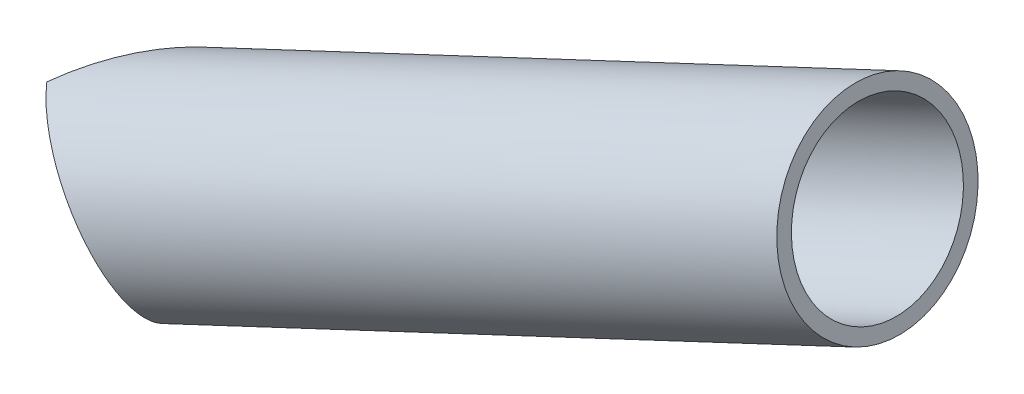
ISO-10303-21;
HEADER;
FILE_DESCRIPTION(('STEP AP214'),'2;1');
FILE_NAME('part.step','',(''),(''),'','','');
FILE_SCHEMA(('AUTOMOTIVE_DESIGN { 1 0 10303 214 1 1 1 1 }'));
ENDSEC;
DATA;
#1=APPLICATION_CONTEXT('core data for automotive mechanical design processes');
#2=APPLICATION_PROTOCOL_DEFINITION('international standard','automotive_design',2000,#1);
#3=PRODUCT_CONTEXT('',#1,'mechanical');
#4=PRODUCT('Part','Part','',(#3));
#5=PRODUCT_RELATED_PRODUCT_CATEGORY('part','',(#4));
#6=PRODUCT_DEFINITION_FORMATION('','',#4);
#7=PRODUCT_DEFINITION_CONTEXT('part definition',#1,'design');
#8=PRODUCT_DEFINITION('design','',#6,#7);
#9=PRODUCT_DEFINITION_SHAPE('','',#8);
#10=(LENGTH_UNIT() NAMED_UNIT(*) SI_UNIT(.MILLI.,.METRE.));
#11=(NAMED_UNIT(*) PLANE_ANGLE_UNIT() SI_UNIT($,.RADIAN.));
#12=(NAMED_UNIT(*) SI_UNIT($,.STERADIAN.) SOLID_ANGLE_UNIT());
#13=UNCERTAINTY_MEASURE_WITH_UNIT(LENGTH_MEASURE(1.E-05),#10,'distance_accuracy_value','');
#14=(GEOMETRIC_REPRESENTATION_CONTEXT(3) GLOBAL_UNCERTAINTY_ASSIGNED_CONTEXT((#13)) GLOBAL_UNIT_ASSIGNED_CONTEXT((#10,
#11,#12)) REPRESENTATION_CONTEXT('',''));
#15=CARTESIAN_POINT('',(0.,0.,0.));
#16=DIRECTION('',(0.,0.,1.));
#17=DIRECTION('',(1.,0.,0.));
#18=AXIS2_PLACEMENT_3D('',#15,#16,#17);
#19=CARTESIAN_POINT('',(-150.,499.999999999999,-1140.));
#20=DIRECTION('',(0.904818702200994,0.425797036329879,0.));
#21=DIRECTION('',(-0.425797036329879,0.904818702200994,0.));
#22=AXIS2_PLACEMENT_3D('',#19,#20,#21);
#23=CYLINDRICAL_SURFACE('',#22,9.39999999999998);
#24=CARTESIAN_POINT('',(-64.9999999999999,539.999999999999,-1140.));
#25=DIRECTION('',(0.975914622854119,0.218152810890676,0.));
#26=DIRECTION('',(-0.218152810890676,0.975914622854119,0.));
#27=AXIS2_PLACEMENT_3D('',#24,#25,#26);
#28=ELLIPSE('',#27,9.63199011457491,9.39999999999998);
#29=CARTESIAN_POINT('',(-67.1012457179656,549.399999999999,-1140.));
#30=VERTEX_POINT('',#29);
#31=EDGE_CURVE('E87',#30,#30,#28,.T.);
#32=ORIENTED_EDGE('',*,*,#31,.T.);
#33=EDGE_LOOP('',(#32));
#34=FACE_BOUND('',#33,.T.);
#35=CARTESIAN_POINT('',(-147.174804903302,511.718325089253,-1140.));
#36=CARTESIAN_POINT('',(-147.069765153826,511.767756026014,-1140.16182487305));
#37=CARTESIAN_POINT('',(-146.960994957135,511.814331371933,-1140.3220936696));
#38=CARTESIAN_POINT('',(-146.737299798762,511.901598910841,-1140.63992880745));
#39=CARTESIAN_POINT('',(-146.622373747903,511.942290057974,-1140.79749466396));
#40=CARTESIAN_POINT('',(-146.269828266371,512.055292250158,-1141.26688039598));
#41=CARTESIAN_POINT('',(-146.02455741703,512.118478234342,-1141.57521443499));
#42=CARTESIAN_POINT('',(-145.519557761149,512.218586126981,-1142.18489613633));
#43=CARTESIAN_POINT('',(-145.259807483312,512.25546784866,-1142.48623243121));
#44=CARTESIAN_POINT('',(-144.730620795151,512.30019420227,-1143.08229972841));
#45=CARTESIAN_POINT('',(-144.46118989732,512.308055103166,-1143.37703433946));
#46=CARTESIAN_POINT('',(-143.981000072123,512.293415296658,-1143.89063503474));
#47=CARTESIAN_POINT('',(-143.771509830137,512.27768425329,-1144.11088975301));
#48=CARTESIAN_POINT('',(-143.350546472571,512.225643876017,-1144.54713309729));
#49=CARTESIAN_POINT('',(-143.139073201271,512.189332912515,-1144.76312138405));
#50=CARTESIAN_POINT('',(-142.71640329377,512.094196267052,-1145.18944634617));
#51=CARTESIAN_POINT('',(-142.505207172687,512.035423611243,-1145.39979509284));
#52=CARTESIAN_POINT('',(-142.084811079382,511.893204163989,-1145.81384037692));
#53=CARTESIAN_POINT('',(-141.875610365919,511.809766935125,-1146.01753945851));
#54=CARTESIAN_POINT('',(-141.374090394241,511.574790607243,-1146.50077049964));
#55=CARTESIAN_POINT('',(-141.08387155746,511.409369453457,-1146.77610947676));
#56=CARTESIAN_POINT('',(-140.662688460546,511.115972602987,-1147.16985585743));
#57=CARTESIAN_POINT('',(-140.524665225587,511.01064275878,-1147.29788200343));
#58=CARTESIAN_POINT('',(-140.254657767163,510.784346458716,-1147.54635337189));
#59=CARTESIAN_POINT('',(-140.12267255663,510.663382571098,-1147.66679983467));
#60=CARTESIAN_POINT('',(-139.886826828217,510.426242301565,-1147.88015846631));
#61=CARTESIAN_POINT('',(-139.781837679675,510.312378505739,-1147.97439853996));
#62=CARTESIAN_POINT('',(-139.578284500829,510.073664780666,-1148.15560613186));
#63=CARTESIAN_POINT('',(-139.479719209967,509.948817018179,-1148.24257507789));
#64=CARTESIAN_POINT('',(-139.290036784035,509.688592624331,-1148.40833869316));
#65=CARTESIAN_POINT('',(-139.198915975857,509.553221250456,-1148.48713739884));
#66=CARTESIAN_POINT('',(-139.024985107044,509.272583927366,-1148.63581087531));
#67=CARTESIAN_POINT('',(-138.942175128538,509.127317880394,-1148.70568555792));
#68=CARTESIAN_POINT('',(-138.785459721982,508.827491450442,-1148.83600065377));
#69=CARTESIAN_POINT('',(-138.71157652054,508.672909248155,-1148.89641762458));
#70=CARTESIAN_POINT('',(-138.573541669559,508.355972796253,-1149.00712696957));
#71=CARTESIAN_POINT('',(-138.509390041301,508.193618529643,-1149.05741932162));
#72=CARTESIAN_POINT('',(-138.391154679292,507.862440086314,-1149.1476293901));
#73=CARTESIAN_POINT('',(-138.337073977837,507.693613979354,-1149.18754398329));
#74=CARTESIAN_POINT('',(-138.239108831187,507.350947637192,-1149.25694220311));
#75=CARTESIAN_POINT('',(-138.195224493118,507.177107349332,-1149.28642572016));
#76=CARTESIAN_POINT('',(-138.11864051748,506.830828995647,-1149.33443068406));
#77=CARTESIAN_POINT('',(-138.085656401997,506.658493504948,-1149.35324205497));
#78=CARTESIAN_POINT('',(-138.028888344476,506.311530662622,-1149.38149201013));
#79=CARTESIAN_POINT('',(-138.005107260492,506.136902616408,-1149.39092768412));
#80=CARTESIAN_POINT('',(-137.946982350876,505.611304831234,-1149.40575419112));
#81=CARTESIAN_POINT('',(-137.925817163662,505.258435965289,-1149.39768910654));
#82=CARTESIAN_POINT('',(-137.911366579613,504.361145344361,-1149.33625911727));
#83=CARTESIAN_POINT('',(-137.93976262982,503.817901650105,-1149.26045812125));
#84=CARTESIAN_POINT('',(-138.025286854095,503.017661568634,-1149.09981690799));
#85=CARTESIAN_POINT('',(-138.061057339753,502.752870836155,-1149.03828719193));
#86=CARTESIAN_POINT('',(-138.145042440875,502.228983971204,-1148.90088877483));
#87=CARTESIAN_POINT('',(-138.19325661318,501.969887636292,-1148.82502058445));
#88=CARTESIAN_POINT('',(-138.325000526231,501.340210345956,-1148.6221259745));
#89=CARTESIAN_POINT('',(-138.414564241438,500.973298092604,-1148.48763915072));
#90=CARTESIAN_POINT('',(-138.611277718176,500.254623788744,-1148.19315439539));
#91=CARTESIAN_POINT('',(-138.718437939975,499.902870907719,-1148.03314129133));
#92=CARTESIAN_POINT('',(-138.945544417175,499.215621437435,-1147.68884042698));
#93=CARTESIAN_POINT('',(-139.065495846927,498.880131507364,-1147.50454283586));
#94=CARTESIAN_POINT('',(-139.313152688936,498.226868575358,-1147.11168986045));
#95=CARTESIAN_POINT('',(-139.440854111933,497.909086617265,-1146.90314690652));
#96=CARTESIAN_POINT('',(-139.648518871169,497.411976698254,-1146.54553161621));
#97=CARTESIAN_POINT('',(-139.727890226601,497.226536671546,-1146.40455947558));
#98=CARTESIAN_POINT('',(-139.885654472558,496.863798962395,-1146.11201178023));
#99=CARTESIAN_POINT('',(-139.964047567875,496.686499554228,-1145.9604384902));
#100=CARTESIAN_POINT('',(-140.11768140451,496.341367445269,-1145.64585474945));
#101=CARTESIAN_POINT('',(-140.192926414663,496.173521810484,-1145.48286064501));
#102=CARTESIAN_POINT('',(-140.337731655912,495.848734934272,-1145.14397088378));
#103=CARTESIAN_POINT('',(-140.407294086787,495.691789476846,-1144.96808026986));
#104=CARTESIAN_POINT('',(-140.516250243288,495.44014438293,-1144.6615191946));
#105=CARTESIAN_POINT('',(-140.558102540328,495.341788851299,-1144.53472477753));
#106=CARTESIAN_POINT('',(-140.636490266243,495.152216548513,-1144.27425443816));
#107=CARTESIAN_POINT('',(-140.673024836072,495.061000931866,-1144.14057740873));
#108=CARTESIAN_POINT('',(-140.739400760586,494.887186220492,-1143.86650870708));
#109=CARTESIAN_POINT('',(-140.769255915096,494.804569552703,-1143.72613161968));
#110=CARTESIAN_POINT('',(-140.821098239812,494.649219358542,-1143.43867987396));
#111=CARTESIAN_POINT('',(-140.843089986687,494.576480098652,-1143.29160916784));
#112=CARTESIAN_POINT('',(-140.878447159134,494.441388763189,-1142.98934293356));
#113=CARTESIAN_POINT('',(-140.891693533643,494.379188280488,-1142.83406516388));
#114=CARTESIAN_POINT('',(-140.908534319049,494.267663549935,-1142.51844117895));
#115=CARTESIAN_POINT('',(-140.912129471754,494.218338312732,-1142.35809535419));
#116=CARTESIAN_POINT('',(-140.909815454918,494.133314698192,-1142.03380162534));
#117=CARTESIAN_POINT('',(-140.90390053674,494.097624579134,-1141.86985160168));
#118=CARTESIAN_POINT('',(-140.883400726734,494.040050054756,-1141.54008702133));
#119=CARTESIAN_POINT('',(-140.86881440311,494.018167930599,-1141.37427216115));
#120=CARTESIAN_POINT('',(-140.830480362714,493.98625077746,-1141.02552977238));
#121=CARTESIAN_POINT('',(-140.805957947163,493.977630800403,-1140.84256059627));
#122=CARTESIAN_POINT('',(-140.750156814986,493.975492715057,-1140.47760280383));
#123=CARTESIAN_POINT('',(-140.718876936715,493.981977205183,-1140.2956143616));
#124=CARTESIAN_POINT('',(-140.651579842718,494.008760948233,-1139.93307661857));
#125=CARTESIAN_POINT('',(-140.615550165143,494.029097149343,-1139.75253247672));
#126=CARTESIAN_POINT('',(-140.540710738139,494.082329809968,-1139.39386805302));
#127=CARTESIAN_POINT('',(-140.501899997399,494.11523076647,-1139.21574866265));
#128=CARTESIAN_POINT('',(-140.403007049053,494.212191091675,-1138.77181673428));
#129=CARTESIAN_POINT('',(-140.342199486314,494.283579920442,-1138.50775533193));
#130=CARTESIAN_POINT('',(-140.222570003845,494.449233634005,-1137.98642030906));
#131=CARTESIAN_POINT('',(-140.163749003817,494.543508953386,-1137.72914984421));
#132=CARTESIAN_POINT('',(-140.051580881604,494.752636099672,-1137.22177305419));
#133=CARTESIAN_POINT('',(-139.998235896601,494.86749591264,-1136.97166955339));
#134=CARTESIAN_POINT('',(-139.899864932005,495.116000546716,-1136.47933835788));
#135=CARTESIAN_POINT('',(-139.854837710111,495.249642557347,-1136.2371094915));
#136=CARTESIAN_POINT('',(-139.774362908487,495.538190831108,-1135.75487579431));
#137=CARTESIAN_POINT('',(-139.73920592561,495.693572775783,-1135.51510647914));
#138=CARTESIAN_POINT('',(-139.682307926113,496.021438632207,-1135.04584611003));
#139=CARTESIAN_POINT('',(-139.660567588387,496.193923408864,-1134.81635557676));
#140=CARTESIAN_POINT('',(-139.632424186053,496.554634358995,-1134.36929059546));
#141=CARTESIAN_POINT('',(-139.626012021193,496.742851123738,-1134.15170915209));
#142=CARTESIAN_POINT('',(-139.630153031466,497.13375677328,-1133.73010382935));
#143=CARTESIAN_POINT('',(-139.640705135403,497.336444743532,-1133.52607909479));
#144=CARTESIAN_POINT('',(-139.679662601582,497.749665051195,-1133.13834301663));
#145=CARTESIAN_POINT('',(-139.707629326724,497.95988845991,-1132.9542593419));
#146=CARTESIAN_POINT('',(-139.781968397961,498.390913525823,-1132.60290094196));
#147=CARTESIAN_POINT('',(-139.828340851132,498.611715244554,-1132.43562631455));
#148=CARTESIAN_POINT('',(-139.939994662571,499.061654587426,-1132.12006345677));
#149=CARTESIAN_POINT('',(-140.005258759385,499.290784435709,-1131.97175807162));
#150=CARTESIAN_POINT('',(-140.154795030971,499.755231572703,-1131.69588800979));
#151=CARTESIAN_POINT('',(-140.239063786514,499.990547741681,-1131.56831960932));
#152=CARTESIAN_POINT('',(-140.412301923551,500.429705277771,-1131.35279810557));
#153=CARTESIAN_POINT('',(-140.498730600261,500.633051594175,-1131.26177624739));
#154=CARTESIAN_POINT('',(-140.684476115587,501.040753920408,-1131.09677770041));
#155=CARTESIAN_POINT('',(-140.783791444653,501.245109809282,-1131.02279901799));
#156=CARTESIAN_POINT('',(-140.994456272404,501.653165189337,-1130.89245988799));
#157=CARTESIAN_POINT('',(-141.105803113011,501.856864815304,-1130.83609555961));
#158=CARTESIAN_POINT('',(-141.339493399215,502.262104990064,-1130.74125949704));
#159=CARTESIAN_POINT('',(-141.461836873834,502.463645533158,-1130.70278781007));
#160=CARTESIAN_POINT('',(-141.709594570501,502.852643485866,-1130.64532692205));
#161=CARTESIAN_POINT('',(-141.834510116525,503.040284651499,-1130.62542068304));
#162=CARTESIAN_POINT('',(-142.091997530198,503.411362761145,-1130.60153987859));
#163=CARTESIAN_POINT('',(-142.224572015651,503.594798237382,-1130.5975707935));
#164=CARTESIAN_POINT('',(-142.496072201184,503.956431977951,-1130.60526614792));
#165=CARTESIAN_POINT('',(-142.634995219659,504.134632402247,-1130.61692404453));
#166=CARTESIAN_POINT('',(-142.918072031661,504.485243970787,-1130.65544359056));
#167=CARTESIAN_POINT('',(-143.062228074694,504.6576525625,-1130.68231185263));
#168=CARTESIAN_POINT('',(-143.365777001664,505.009151863722,-1130.7534077988));
#169=CARTESIAN_POINT('',(-143.5254866963,505.187729978522,-1130.79881611341));
#170=CARTESIAN_POINT('',(-143.847894087768,505.53696565296,-1130.9060342512));
#171=CARTESIAN_POINT('',(-144.010590935851,505.707625415306,-1130.96783948062));
#172=CARTESIAN_POINT('',(-144.337702632676,506.041070713475,-1131.10730565597));
#173=CARTESIAN_POINT('',(-144.502119430904,506.203845781869,-1131.18498700141));
#174=CARTESIAN_POINT('',(-144.830862911545,506.521209448391,-1131.35555020312));
#175=CARTESIAN_POINT('',(-144.995189605813,506.675799834072,-1131.448428722));
#176=CARTESIAN_POINT('',(-145.346426638915,506.9993170397,-1131.66378890332));
#177=CARTESIAN_POINT('',(-145.533073395515,507.166971608521,-1131.78861794388));
#178=CARTESIAN_POINT('',(-145.901514451679,507.492253023072,-1132.05722165767));
#179=CARTESIAN_POINT('',(-146.083307431223,507.649877156752,-1132.20100142285));
#180=CARTESIAN_POINT('',(-146.438754949294,507.955777047082,-1132.50718901394));
#181=CARTESIAN_POINT('',(-146.612412328093,508.104056072599,-1132.66959026949));
#182=CARTESIAN_POINT('',(-146.947647915554,508.392342586544,-1133.01305434708));
#183=CARTESIAN_POINT('',(-147.109232270525,508.532354276108,-1133.19410756027));
#184=CARTESIAN_POINT('',(-147.358194113038,508.75464651832,-1133.5041559052));
#185=CARTESIAN_POINT('',(-147.450814782162,508.839026582515,-1133.62745982888));
#186=CARTESIAN_POINT('',(-147.62758924279,509.005428450336,-1133.88148810622));
#187=CARTESIAN_POINT('',(-147.711745404913,509.087450909624,-1134.01221036612));
#188=CARTESIAN_POINT('',(-147.869543186815,509.249346856138,-1134.28070622178));
#189=CARTESIAN_POINT('',(-147.943205660024,509.329224342001,-1134.41846507213));
#190=CARTESIAN_POINT('',(-148.078051819697,509.487297143259,-1134.70090726932));
#191=CARTESIAN_POINT('',(-148.139238145908,509.565492811361,-1134.84558914335));
#192=CARTESIAN_POINT('',(-148.237675941664,509.707110546746,-1135.11580702338));
#193=CARTESIAN_POINT('',(-148.277231910094,509.770769224516,-1135.24037833591));
#194=CARTESIAN_POINT('',(-148.345068560718,509.897044913073,-1135.49305829915));
#195=CARTESIAN_POINT('',(-148.373351953525,509.959662170807,-1135.62116609154));
#196=CARTESIAN_POINT('',(-148.41773944415,510.083704726357,-1135.8799162067));
#197=CARTESIAN_POINT('',(-148.433854013006,510.145131004535,-1136.01055625098));
#198=CARTESIAN_POINT('',(-148.453495116756,510.266636020918,-1136.27340289493));
#199=CARTESIAN_POINT('',(-148.457021514842,510.326714744472,-1136.40560951162));
#200=CARTESIAN_POINT('',(-148.451571490968,510.445139924928,-1136.67024700258));
#201=CARTESIAN_POINT('',(-148.442617741351,510.503489326932,-1136.80267703479));
#202=CARTESIAN_POINT('',(-148.412849837937,510.618284482159,-1137.06704921086));
#203=CARTESIAN_POINT('',(-148.392030591901,510.674729407026,-1137.19899112076));
#204=CARTESIAN_POINT('',(-148.313106857068,510.840899570025,-1137.59315794451));
#205=CARTESIAN_POINT('',(-148.238541707854,510.947387465475,-1137.85356093469));
#206=CARTESIAN_POINT('',(-148.088192737625,511.113507933563,-1138.27379318005));
#207=CARTESIAN_POINT('',(-148.022425993116,511.176253746463,-1138.43621542069));
#208=CARTESIAN_POINT('',(-147.879243645047,511.297252179497,-1138.75762670499));
#209=CARTESIAN_POINT('',(-147.801825592537,511.355503851119,-1138.91661501883));
#210=CARTESIAN_POINT('',(-147.63732014823,511.467364222514,-1139.23141410504));
#211=CARTESIAN_POINT('',(-147.550220475995,511.520966868398,-1139.38722053812));
#212=CARTESIAN_POINT('',(-147.368105537177,511.623322235377,-1139.69580595934));
#213=CARTESIAN_POINT('',(-147.273088208471,511.672073685696,-1139.84858414589));
#214=CARTESIAN_POINT('',(-147.174804903302,511.718325089253,-1140.));
#215=B_SPLINE_CURVE_WITH_KNOTS('',3,(#35,#36,#37,#38,#39,#40,#41,#42,#43,#44,#45,#46,#47,#48,
#49,#50,#51,#52,#53,#54,#55,#56,#57,#58,#59,#60,#61,#62,#63,#64,#65,#66,#67,#68,#69,#70,#71,#72,
#73,#74,#75,#76,#77,#78,#79,#80,#81,#82,#83,#84,#85,#86,#87,#88,#89,#90,#91,#92,#93,#94,#95,#96,
#97,#98,#99,#100,#101,#102,#103,#104,#105,#106,#107,#108,#109,#110,#111,#112,#113,#114,#115,
#116,#117,#118,#119,#120,#121,#122,#123,#124,#125,#126,#127,#128,#129,#130,#131,#132,#133,#134,
#135,#136,#137,#138,#139,#140,#141,#142,#143,#144,#145,#146,#147,#148,#149,#150,#151,#152,#153,
#154,#155,#156,#157,#158,#159,#160,#161,#162,#163,#164,#165,#166,#167,#168,#169,#170,#171,#172,
#173,#174,#175,#176,#177,#178,#179,#180,#181,#182,#183,#184,#185,#186,#187,#188,#189,#190,#191,
#192,#193,#194,#195,#196,#197,#198,#199,#200,#201,#202,#203,#204,#205,#206,#207,#208,#209,#210,
#211,#212,#213,#214),.UNSPECIFIED.,.T.,.F.,(4,2,2,2,2,2,2,2,2,2,2,2,2,2,2,2,2,2,2,2,2,2,2,2,2,2,
2,2,2,2,2,2,2,2,2,2,2,2,2,2,2,2,2,2,2,2,2,2,2,2,2,2,2,2,2,2,2,2,2,2,2,2,2,2,2,2,2,2,2,2,2,2,2,2,
2,2,2,2,2,2,2,2,2,2,2,2,2,2,2,4),(0.,0.597413478311442,1.19493301062636,2.39061764567734,
3.58812511736001,4.7849611687105,5.69745040097109,6.6100118977928,7.52043225273096,
8.43050009490288,9.72384717477512,10.370386395353,11.0168195421969,11.5601687574864,
12.1034110278931,12.646383623062,13.1893615834386,13.7336647884659,14.2779691837436,
14.8224372017144,15.3669109398038,15.8957818945354,16.4248169616012,17.4823189984896,
19.1203117343458,19.9423899837486,20.764438960353,21.9654505790479,23.1671787426263,
24.3693948915894,25.5709973715212,26.3089732338567,27.0467919240987,27.7835753560358,
28.5200722073779,29.0172699631914,29.5145479493118,30.0107888604037,30.5067404768863,
31.0093114459388,31.5118437854134,32.0146800091867,32.5175992828005,33.0711672915318,
33.6248305373944,34.1799764435131,34.7353212255838,35.5747507347419,36.4145636842207,
37.2547031599066,38.0947170547469,38.957349880634,39.8200263530123,40.6821905317936,
41.5443002719324,42.3855277785586,43.2267601791097,44.0672263517439,44.9075414321233,
45.6235128624812,46.3394004990919,47.0551302994229,47.7708619887604,48.4490064078724,
49.1273840021095,49.8054776529942,50.4838663285957,51.214658124532,51.9452453966405,
52.6767773828301,53.408148936112,54.2479470267864,55.0879712273153,55.9276999422567,
56.7669982011471,57.2940577412831,57.820969256701,58.3468186145905,58.8725565957065,
59.3082550086464,59.7438485899185,60.1790669228823,60.6142899857574,61.0487234205033,
61.4833434388103,62.3531131548789,62.9111197096406,63.4692437142174,64.0280839163187,
64.5870701238667),.UNSPECIFIED.);
#216=CARTESIAN_POINT('',(-147.174804903302,511.718325089253,-1140.));
#217=VERTEX_POINT('',#216);
#218=EDGE_CURVE('E81',#217,#217,#215,.T.);
#219=ORIENTED_EDGE('',*,*,#218,.T.);
#220=EDGE_LOOP('',(#219));
#221=FACE_BOUND('',#220,.T.);
#222=ADVANCED_FACE('F41',(#34,#221),#23,.F.);
#223=CARTESIAN_POINT('',(-65.,540.,-1140.));
#224=DIRECTION('',(0.975914622854119,0.218152810890676,0.));
#225=DIRECTION('',(-0.218152810890676,0.975914622854119,0.));
#226=AXIS2_PLACEMENT_3D('',#223,#224,#225);
#227=PLANE('',#226);
#228=ORIENTED_EDGE('',*,*,#31,.F.);
#229=EDGE_LOOP('',(#228));
#230=FACE_BOUND('',#229,.T.);
#231=CARTESIAN_POINT('',(-64.9999999999999,539.999999999999,-1140.));
#232=DIRECTION('',(0.975914622854119,0.218152810890676,0.));
#233=DIRECTION('',(-0.218152810890676,0.975914622854119,0.));
#234=AXIS2_PLACEMENT_3D('',#231,#232,#233);
#235=ELLIPSE('',#234,11.2714777936515,11.);
#236=CARTESIAN_POINT('',(-67.4589045635768,550.999999999999,-1140.));
#237=VERTEX_POINT('',#236);
#238=EDGE_CURVE('E57',#237,#237,#235,.T.);
#239=ORIENTED_EDGE('',*,*,#238,.T.);
#240=EDGE_LOOP('',(#239));
#241=FACE_BOUND('',#240,.T.);
#242=ADVANCED_FACE('F43',(#230,#241),#227,.T.);
#243=CARTESIAN_POINT('',(-150.,499.999999999999,-1140.));
#244=DIRECTION('',(0.904818702200994,0.425797036329879,0.));
#245=DIRECTION('',(-0.425797036329879,0.904818702200994,0.));
#246=AXIS2_PLACEMENT_3D('',#243,#244,#245);
#247=CYLINDRICAL_SURFACE('',#246,11.);
#248=ORIENTED_EDGE('',*,*,#238,.F.);
#249=EDGE_LOOP('',(#248));
#250=FACE_BOUND('',#249,.T.);
#251=CARTESIAN_POINT('',(-150.,500.,-1140.));
#252=DIRECTION('',(0.661636513716334,0.0238473310187051,0.749445413969943));
#253=DIRECTION('',(0.632795525843136,0.518432072130128,-0.575150422984954));
#254=AXIS2_PLACEMENT_3D('',#251,#252,#253);
#255=ELLIPSE('',#254,18.0678796082317,11.);
#256=CARTESIAN_POINT('',(-154.424775755789,509.402648481051,-1136.39284585126));
#257=VERTEX_POINT('',#256);
#258=CARTESIAN_POINT('',(-145.575224244212,490.597351518949,-1143.60715414874));
#259=VERTEX_POINT('',#258);
#260=EDGE_CURVE('E11',#257,#259,#255,.F.);
#261=ORIENTED_EDGE('',*,*,#260,.F.);
#262=CARTESIAN_POINT('',(-150.,500.,-1140.));
#263=DIRECTION('',(0.632795525843136,0.518432072130128,-0.575150422984954));
#264=DIRECTION('',(0.661636513716334,0.0238473310187051,0.749445413969943));
#265=AXIS2_PLACEMENT_3D('',#262,#263,#264);
#266=ELLIPSE('',#265,13.8659179246541,11.);
#267=EDGE_CURVE('E49',#259,#257,#266,.F.);
#268=ORIENTED_EDGE('',*,*,#267,.F.);
#269=EDGE_LOOP('',(#261,#268));
#270=FACE_BOUND('',#269,.T.);
#271=ADVANCED_FACE('F58',(#250,#270),#247,.T.);
#272=CARTESIAN_POINT('',(-150.,500.,-1140.));
#273=DIRECTION('',(-0.0991899501072693,-0.396759800429077,0.912547540986877));
#274=DIRECTION('',(0.,-0.917070056253235,-0.39872611141445));
#275=AXIS2_PLACEMENT_3D('',#272,#273,#274);
#276=CYLINDRICAL_SURFACE('',#275,11.);
#277=ORIENTED_EDGE('',*,*,#218,.F.);
#278=EDGE_LOOP('',(#277));
#279=FACE_BOUND('',#278,.T.);
#280=ORIENTED_EDGE('',*,*,#260,.T.);
#281=ORIENTED_EDGE('',*,*,#267,.T.);
#282=EDGE_LOOP('',(#280,#281));
#283=FACE_BOUND('',#282,.T.);
#284=ADVANCED_FACE('F55',(#279,#283),#276,.F.);
#285=CLOSED_SHELL('',(#222,#242,#271,#284));
#286=MANIFOLD_SOLID_BREP('B2',#285);
#287=ADVANCED_BREP_SHAPE_REPRESENTATION('',(#18,#286),#14);
#288=SHAPE_DEFINITION_REPRESENTATION(#9,#287);
ENDSEC;
END-ISO-10303-21;
